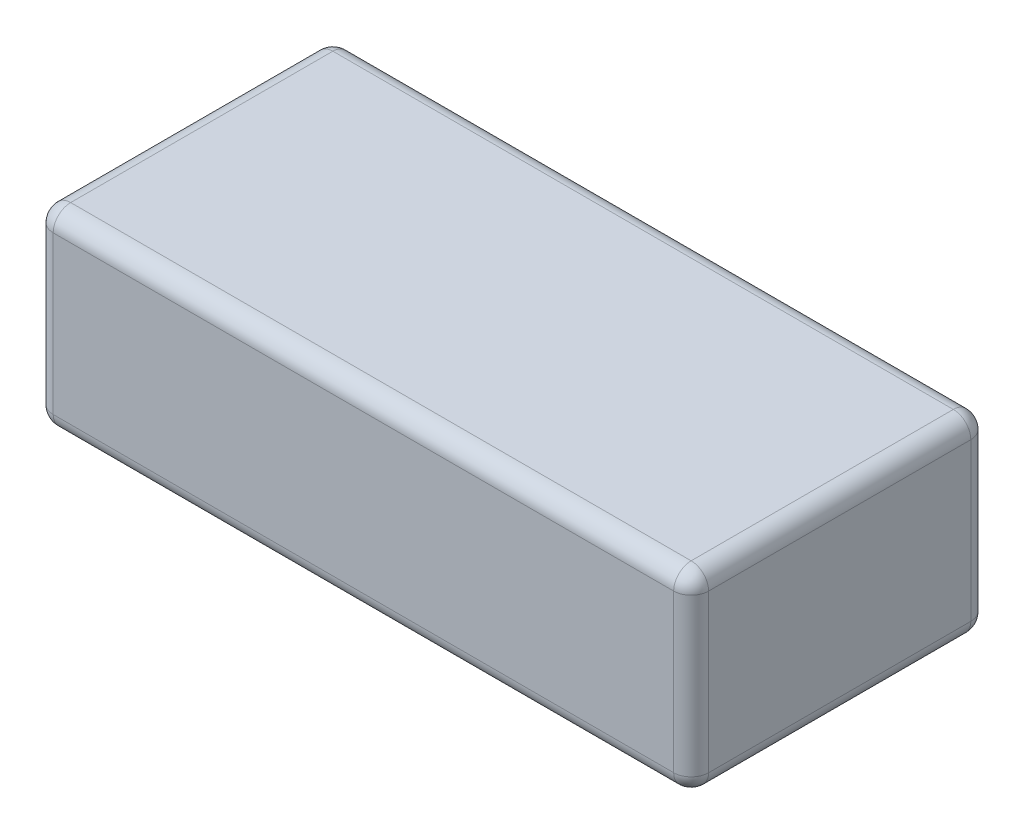
ISO-10303-21;
HEADER;
FILE_DESCRIPTION(('STEP AP214'),'2;1');
FILE_NAME('part.step','',(''),(''),'','','');
FILE_SCHEMA(('AUTOMOTIVE_DESIGN { 1 0 10303 214 1 1 1 1 }'));
ENDSEC;
DATA;
#1=APPLICATION_CONTEXT('core data for automotive mechanical design processes');
#2=APPLICATION_PROTOCOL_DEFINITION('international standard','automotive_design',2000,#1);
#3=PRODUCT_CONTEXT('',#1,'mechanical');
#4=PRODUCT('Part','Part','',(#3));
#5=PRODUCT_RELATED_PRODUCT_CATEGORY('part','',(#4));
#6=PRODUCT_DEFINITION_FORMATION('','',#4);
#7=PRODUCT_DEFINITION_CONTEXT('part definition',#1,'design');
#8=PRODUCT_DEFINITION('design','',#6,#7);
#9=PRODUCT_DEFINITION_SHAPE('','',#8);
#10=(LENGTH_UNIT() NAMED_UNIT(*) SI_UNIT(.MILLI.,.METRE.));
#11=(NAMED_UNIT(*) PLANE_ANGLE_UNIT() SI_UNIT($,.RADIAN.));
#12=(NAMED_UNIT(*) SI_UNIT($,.STERADIAN.) SOLID_ANGLE_UNIT());
#13=UNCERTAINTY_MEASURE_WITH_UNIT(LENGTH_MEASURE(1.E-05),#10,'distance_accuracy_value','');
#14=(GEOMETRIC_REPRESENTATION_CONTEXT(3) GLOBAL_UNCERTAINTY_ASSIGNED_CONTEXT((#13)) GLOBAL_UNIT_ASSIGNED_CONTEXT((#10,
#11,#12)) REPRESENTATION_CONTEXT('',''));
#15=CARTESIAN_POINT('',(0.,0.,0.));
#16=DIRECTION('',(0.,0.,1.));
#17=DIRECTION('',(1.,0.,0.));
#18=AXIS2_PLACEMENT_3D('',#15,#16,#17);
#19=CARTESIAN_POINT('',(35.5,93.,-48.));
#20=DIRECTION('',(0.,-1.,0.));
#21=DIRECTION('',(1.,0.,0.));
#22=AXIS2_PLACEMENT_3D('',#19,#20,#21);
#23=SPHERICAL_SURFACE('',#22,2.);
#24=CARTESIAN_POINT('',(35.5,93.,-48.));
#25=DIRECTION('',(0.,0.,-1.));
#26=DIRECTION('',(1.,0.,0.));
#27=AXIS2_PLACEMENT_3D('',#24,#25,#26);
#28=CIRCLE('',#27,2.);
#29=CARTESIAN_POINT('',(35.5,95.,-48.));
#30=VERTEX_POINT('',#29);
#31=CARTESIAN_POINT('',(37.5,93.,-48.));
#32=VERTEX_POINT('',#31);
#33=EDGE_CURVE('E10',#30,#32,#28,.T.);
#34=ORIENTED_EDGE('',*,*,#33,.F.);
#35=CARTESIAN_POINT('',(35.5,93.,-48.));
#36=DIRECTION('',(1.,0.,0.));
#37=DIRECTION('',(0.,0.,1.));
#38=AXIS2_PLACEMENT_3D('',#35,#36,#37);
#39=CIRCLE('',#38,2.);
#40=CARTESIAN_POINT('',(35.5,93.,-46.));
#41=VERTEX_POINT('',#40);
#42=EDGE_CURVE('E284',#30,#41,#39,.T.);
#43=ORIENTED_EDGE('',*,*,#42,.T.);
#44=CARTESIAN_POINT('',(35.5,93.,-48.));
#45=DIRECTION('',(0.,-1.,0.));
#46=DIRECTION('',(1.,0.,0.));
#47=AXIS2_PLACEMENT_3D('',#44,#45,#46);
#48=CIRCLE('',#47,2.);
#49=EDGE_CURVE('E255',#32,#41,#48,.T.);
#50=ORIENTED_EDGE('',*,*,#49,.F.);
#51=EDGE_LOOP('',(#34,#43,#50));
#52=FACE_BOUND('',#51,.T.);
#53=ADVANCED_FACE('F16',(#52),#23,.T.);
#54=CARTESIAN_POINT('',(35.5,93.,-78.));
#55=DIRECTION('',(0.,0.,1.));
#56=DIRECTION('',(1.,0.,0.));
#57=AXIS2_PLACEMENT_3D('',#54,#55,#56);
#58=SPHERICAL_SURFACE('',#57,2.);
#59=CARTESIAN_POINT('',(35.5,93.,-78.));
#60=DIRECTION('',(0.,-1.,0.));
#61=DIRECTION('',(1.,0.,0.));
#62=AXIS2_PLACEMENT_3D('',#59,#60,#61);
#63=CIRCLE('',#62,2.);
#64=CARTESIAN_POINT('',(35.5,93.,-80.));
#65=VERTEX_POINT('',#64);
#66=CARTESIAN_POINT('',(37.5,93.,-78.));
#67=VERTEX_POINT('',#66);
#68=EDGE_CURVE('E276',#65,#67,#63,.T.);
#69=ORIENTED_EDGE('',*,*,#68,.F.);
#70=CARTESIAN_POINT('',(35.5,93.,-78.));
#71=DIRECTION('',(1.,0.,0.));
#72=DIRECTION('',(0.,1.,0.));
#73=AXIS2_PLACEMENT_3D('',#70,#71,#72);
#74=CIRCLE('',#73,2.);
#75=CARTESIAN_POINT('',(35.5,95.,-78.));
#76=VERTEX_POINT('',#75);
#77=EDGE_CURVE('E219',#65,#76,#74,.T.);
#78=ORIENTED_EDGE('',*,*,#77,.T.);
#79=CARTESIAN_POINT('',(35.5,93.,-78.));
#80=DIRECTION('',(0.,0.,1.));
#81=DIRECTION('',(1.,0.,0.));
#82=AXIS2_PLACEMENT_3D('',#79,#80,#81);
#83=CIRCLE('',#82,2.);
#84=EDGE_CURVE('E24',#67,#76,#83,.T.);
#85=ORIENTED_EDGE('',*,*,#84,.F.);
#86=EDGE_LOOP('',(#69,#78,#85));
#87=FACE_BOUND('',#86,.T.);
#88=ADVANCED_FACE('F297',(#87),#58,.T.);
#89=CARTESIAN_POINT('',(37.5,73.,-80.));
#90=DIRECTION('',(1.,0.,0.));
#91=DIRECTION('',(0.,1.,0.));
#92=AXIS2_PLACEMENT_3D('',#89,#90,#91);
#93=PLANE('',#92);
#94=DIRECTION('',(0.,0.,1.));
#95=VECTOR('',#94,1.);
#96=CARTESIAN_POINT('',(37.5,75.,-80.));
#97=LINE('',#96,#95);
#98=CARTESIAN_POINT('',(37.5,75.,-78.));
#99=VERTEX_POINT('',#98);
#100=CARTESIAN_POINT('',(37.5,75.,-48.));
#101=VERTEX_POINT('',#100);
#102=EDGE_CURVE('E144',#99,#101,#97,.T.);
#103=ORIENTED_EDGE('',*,*,#102,.F.);
#104=DIRECTION('',(0.,1.,0.));
#105=VECTOR('',#104,1.);
#106=CARTESIAN_POINT('',(37.5,73.,-78.));
#107=LINE('',#106,#105);
#108=EDGE_CURVE('E280',#99,#67,#107,.T.);
#109=ORIENTED_EDGE('',*,*,#108,.T.);
#110=DIRECTION('',(0.,0.,1.));
#111=VECTOR('',#110,1.);
#112=CARTESIAN_POINT('',(37.5,93.,-80.));
#113=LINE('',#112,#111);
#114=EDGE_CURVE('E290',#67,#32,#113,.T.);
#115=ORIENTED_EDGE('',*,*,#114,.T.);
#116=DIRECTION('',(0.,1.,0.));
#117=VECTOR('',#116,1.);
#118=CARTESIAN_POINT('',(37.5,73.,-48.));
#119=LINE('',#118,#117);
#120=EDGE_CURVE('E259',#101,#32,#119,.T.);
#121=ORIENTED_EDGE('',*,*,#120,.F.);
#122=EDGE_LOOP('',(#103,#109,#115,#121));
#123=FACE_BOUND('',#122,.T.);
#124=ADVANCED_FACE('F370',(#123),#93,.T.);
#125=CARTESIAN_POINT('',(35.5,75.,-48.));
#126=DIRECTION('',(0.,0.,-1.));
#127=DIRECTION('',(1.,0.,0.));
#128=AXIS2_PLACEMENT_3D('',#125,#126,#127);
#129=SPHERICAL_SURFACE('',#128,2.);
#130=CARTESIAN_POINT('',(35.5,75.,-48.));
#131=DIRECTION('',(0.,1.,0.));
#132=DIRECTION('',(1.,0.,0.));
#133=AXIS2_PLACEMENT_3D('',#130,#131,#132);
#134=CIRCLE('',#133,2.);
#135=CARTESIAN_POINT('',(35.5,75.,-46.));
#136=VERTEX_POINT('',#135);
#137=EDGE_CURVE('E258',#136,#101,#134,.T.);
#138=ORIENTED_EDGE('',*,*,#137,.F.);
#139=CARTESIAN_POINT('',(35.5,75.,-48.));
#140=DIRECTION('',(1.,0.,0.));
#141=DIRECTION('',(0.,-1.,0.));
#142=AXIS2_PLACEMENT_3D('',#139,#140,#141);
#143=CIRCLE('',#142,2.);
#144=CARTESIAN_POINT('',(35.5,73.,-48.));
#145=VERTEX_POINT('',#144);
#146=EDGE_CURVE('E156',#136,#145,#143,.T.);
#147=ORIENTED_EDGE('',*,*,#146,.T.);
#148=CARTESIAN_POINT('',(35.5,75.,-48.));
#149=DIRECTION('',(0.,0.,-1.));
#150=DIRECTION('',(1.,0.,0.));
#151=AXIS2_PLACEMENT_3D('',#148,#149,#150);
#152=CIRCLE('',#151,2.);
#153=EDGE_CURVE('E145',#101,#145,#152,.T.);
#154=ORIENTED_EDGE('',*,*,#153,.F.);
#155=EDGE_LOOP('',(#138,#147,#154));
#156=FACE_BOUND('',#155,.T.);
#157=ADVANCED_FACE('F372',(#156),#129,.T.);
#158=CARTESIAN_POINT('',(35.5,75.,-78.));
#159=DIRECTION('',(0.,0.,1.));
#160=DIRECTION('',(1.,0.,0.));
#161=AXIS2_PLACEMENT_3D('',#158,#159,#160);
#162=SPHERICAL_SURFACE('',#161,2.);
#163=CARTESIAN_POINT('',(35.5,75.,-78.));
#164=DIRECTION('',(0.,0.,-1.));
#165=DIRECTION('',(1.,0.,0.));
#166=AXIS2_PLACEMENT_3D('',#163,#164,#165);
#167=CIRCLE('',#166,2.);
#168=CARTESIAN_POINT('',(35.5,73.,-78.));
#169=VERTEX_POINT('',#168);
#170=EDGE_CURVE('E133',#99,#169,#167,.T.);
#171=ORIENTED_EDGE('',*,*,#170,.T.);
#172=CARTESIAN_POINT('',(35.5,75.,-78.));
#173=DIRECTION('',(-1.,0.,0.));
#174=DIRECTION('',(0.,-1.,0.));
#175=AXIS2_PLACEMENT_3D('',#172,#173,#174);
#176=CIRCLE('',#175,2.);
#177=CARTESIAN_POINT('',(35.5,75.,-80.));
#178=VERTEX_POINT('',#177);
#179=EDGE_CURVE('E136',#178,#169,#176,.T.);
#180=ORIENTED_EDGE('',*,*,#179,.F.);
#181=CARTESIAN_POINT('',(35.5,75.,-78.));
#182=DIRECTION('',(0.,-1.,0.));
#183=DIRECTION('',(1.,0.,0.));
#184=AXIS2_PLACEMENT_3D('',#181,#182,#183);
#185=CIRCLE('',#184,2.);
#186=EDGE_CURVE('E138',#178,#99,#185,.T.);
#187=ORIENTED_EDGE('',*,*,#186,.T.);
#188=EDGE_LOOP('',(#171,#180,#187));
#189=FACE_BOUND('',#188,.T.);
#190=ADVANCED_FACE('F135',(#189),#162,.T.);
#191=CARTESIAN_POINT('',(35.5,93.,-80.));
#192=DIRECTION('',(0.,0.,1.));
#193=DIRECTION('',(1.,0.,0.));
#194=AXIS2_PLACEMENT_3D('',#191,#192,#193);
#195=CYLINDRICAL_SURFACE('',#194,2.);
#196=ORIENTED_EDGE('',*,*,#114,.F.);
#197=ORIENTED_EDGE('',*,*,#84,.T.);
#198=DIRECTION('',(0.,0.,1.));
#199=VECTOR('',#198,1.);
#200=CARTESIAN_POINT('',(35.5,95.,-80.));
#201=LINE('',#200,#199);
#202=EDGE_CURVE('E235',#76,#30,#201,.T.);
#203=ORIENTED_EDGE('',*,*,#202,.T.);
#204=ORIENTED_EDGE('',*,*,#33,.T.);
#205=EDGE_LOOP('',(#196,#197,#203,#204));
#206=FACE_BOUND('',#205,.T.);
#207=ADVANCED_FACE('F294',(#206),#195,.T.);
#208=CARTESIAN_POINT('',(35.5,73.,-48.));
#209=DIRECTION('',(0.,1.,0.));
#210=DIRECTION('',(1.,0.,0.));
#211=AXIS2_PLACEMENT_3D('',#208,#209,#210);
#212=CYLINDRICAL_SURFACE('',#211,2.);
#213=ORIENTED_EDGE('',*,*,#120,.T.);
#214=ORIENTED_EDGE('',*,*,#49,.T.);
#215=DIRECTION('',(0.,1.,0.));
#216=VECTOR('',#215,1.);
#217=CARTESIAN_POINT('',(35.5,73.,-46.));
#218=LINE('',#217,#216);
#219=EDGE_CURVE('E246',#136,#41,#218,.T.);
#220=ORIENTED_EDGE('',*,*,#219,.F.);
#221=ORIENTED_EDGE('',*,*,#137,.T.);
#222=EDGE_LOOP('',(#213,#214,#220,#221));
#223=FACE_BOUND('',#222,.T.);
#224=ADVANCED_FACE('F326',(#223),#212,.T.);
#225=CARTESIAN_POINT('',(-37.5,93.,-48.));
#226=DIRECTION('',(1.,0.,0.));
#227=DIRECTION('',(0.,1.,0.));
#228=AXIS2_PLACEMENT_3D('',#225,#226,#227);
#229=CYLINDRICAL_SURFACE('',#228,2.);
#230=CARTESIAN_POINT('',(-35.5,93.,-48.));
#231=DIRECTION('',(1.,0.,0.));
#232=DIRECTION('',(0.,0.,1.));
#233=AXIS2_PLACEMENT_3D('',#230,#231,#232);
#234=CIRCLE('',#233,2.);
#235=CARTESIAN_POINT('',(-35.5,95.,-48.));
#236=VERTEX_POINT('',#235);
#237=CARTESIAN_POINT('',(-35.5,93.,-46.));
#238=VERTEX_POINT('',#237);
#239=EDGE_CURVE('E254',#236,#238,#234,.T.);
#240=ORIENTED_EDGE('',*,*,#239,.T.);
#241=DIRECTION('',(1.,0.,0.));
#242=VECTOR('',#241,1.);
#243=CARTESIAN_POINT('',(-37.5,93.,-46.));
#244=LINE('',#243,#242);
#245=EDGE_CURVE('E250',#238,#41,#244,.T.);
#246=ORIENTED_EDGE('',*,*,#245,.T.);
#247=ORIENTED_EDGE('',*,*,#42,.F.);
#248=DIRECTION('',(1.,0.,0.));
#249=VECTOR('',#248,1.);
#250=CARTESIAN_POINT('',(-37.5,95.,-48.));
#251=LINE('',#250,#249);
#252=EDGE_CURVE('E262',#236,#30,#251,.T.);
#253=ORIENTED_EDGE('',*,*,#252,.F.);
#254=EDGE_LOOP('',(#240,#246,#247,#253));
#255=FACE_BOUND('',#254,.T.);
#256=ADVANCED_FACE('F309',(#255),#229,.T.);
#257=CARTESIAN_POINT('',(35.5,73.,-78.));
#258=DIRECTION('',(0.,1.,0.));
#259=DIRECTION('',(1.,0.,0.));
#260=AXIS2_PLACEMENT_3D('',#257,#258,#259);
#261=CYLINDRICAL_SURFACE('',#260,2.);
#262=ORIENTED_EDGE('',*,*,#186,.F.);
#263=DIRECTION('',(0.,1.,0.));
#264=VECTOR('',#263,1.);
#265=CARTESIAN_POINT('',(35.5,73.,-80.));
#266=LINE('',#265,#264);
#267=EDGE_CURVE('E228',#178,#65,#266,.T.);
#268=ORIENTED_EDGE('',*,*,#267,.T.);
#269=ORIENTED_EDGE('',*,*,#68,.T.);
#270=ORIENTED_EDGE('',*,*,#108,.F.);
#271=EDGE_LOOP('',(#262,#268,#269,#270));
#272=FACE_BOUND('',#271,.T.);
#273=ADVANCED_FACE('F368',(#272),#261,.T.);
#274=CARTESIAN_POINT('',(-37.5,93.,-78.));
#275=DIRECTION('',(1.,0.,0.));
#276=DIRECTION('',(0.,1.,0.));
#277=AXIS2_PLACEMENT_3D('',#274,#275,#276);
#278=CYLINDRICAL_SURFACE('',#277,2.);
#279=DIRECTION('',(1.,0.,0.));
#280=VECTOR('',#279,1.);
#281=CARTESIAN_POINT('',(-37.5,95.,-78.));
#282=LINE('',#281,#280);
#283=CARTESIAN_POINT('',(-35.5,95.,-78.));
#284=VERTEX_POINT('',#283);
#285=EDGE_CURVE('E157',#284,#76,#282,.T.);
#286=ORIENTED_EDGE('',*,*,#285,.T.);
#287=ORIENTED_EDGE('',*,*,#77,.F.);
#288=DIRECTION('',(1.,0.,0.));
#289=VECTOR('',#288,1.);
#290=CARTESIAN_POINT('',(-37.5,93.,-80.));
#291=LINE('',#290,#289);
#292=CARTESIAN_POINT('',(-35.5,93.,-80.));
#293=VERTEX_POINT('',#292);
#294=EDGE_CURVE('E224',#293,#65,#291,.T.);
#295=ORIENTED_EDGE('',*,*,#294,.F.);
#296=CARTESIAN_POINT('',(-35.5,93.,-78.));
#297=DIRECTION('',(1.,0.,0.));
#298=DIRECTION('',(0.,1.,0.));
#299=AXIS2_PLACEMENT_3D('',#296,#297,#298);
#300=CIRCLE('',#299,2.);
#301=EDGE_CURVE('E238',#293,#284,#300,.T.);
#302=ORIENTED_EDGE('',*,*,#301,.T.);
#303=EDGE_LOOP('',(#286,#287,#295,#302));
#304=FACE_BOUND('',#303,.T.);
#305=ADVANCED_FACE('F300',(#304),#278,.T.);
#306=CARTESIAN_POINT('',(35.5,75.,-80.));
#307=DIRECTION('',(0.,0.,1.));
#308=DIRECTION('',(1.,0.,0.));
#309=AXIS2_PLACEMENT_3D('',#306,#307,#308);
#310=CYLINDRICAL_SURFACE('',#309,2.);
#311=ORIENTED_EDGE('',*,*,#153,.T.);
#312=DIRECTION('',(0.,0.,1.));
#313=VECTOR('',#312,1.);
#314=CARTESIAN_POINT('',(35.5,73.,-80.));
#315=LINE('',#314,#313);
#316=EDGE_CURVE('E160',#169,#145,#315,.T.);
#317=ORIENTED_EDGE('',*,*,#316,.F.);
#318=ORIENTED_EDGE('',*,*,#170,.F.);
#319=ORIENTED_EDGE('',*,*,#102,.T.);
#320=EDGE_LOOP('',(#311,#317,#318,#319));
#321=FACE_BOUND('',#320,.T.);
#322=ADVANCED_FACE('F161',(#321),#310,.T.);
#323=CARTESIAN_POINT('',(-37.5,75.,-48.));
#324=DIRECTION('',(1.,0.,0.));
#325=DIRECTION('',(0.,-1.,0.));
#326=AXIS2_PLACEMENT_3D('',#323,#324,#325);
#327=CYLINDRICAL_SURFACE('',#326,2.);
#328=DIRECTION('',(1.,0.,0.));
#329=VECTOR('',#328,1.);
#330=CARTESIAN_POINT('',(-37.5,73.,-48.));
#331=LINE('',#330,#329);
#332=CARTESIAN_POINT('',(-35.5,73.,-48.));
#333=VERTEX_POINT('',#332);
#334=EDGE_CURVE('E166',#333,#145,#331,.T.);
#335=ORIENTED_EDGE('',*,*,#334,.T.);
#336=ORIENTED_EDGE('',*,*,#146,.F.);
#337=DIRECTION('',(1.,0.,0.));
#338=VECTOR('',#337,1.);
#339=CARTESIAN_POINT('',(-37.5,75.,-46.));
#340=LINE('',#339,#338);
#341=CARTESIAN_POINT('',(-35.5,75.,-46.));
#342=VERTEX_POINT('',#341);
#343=EDGE_CURVE('E242',#342,#136,#340,.T.);
#344=ORIENTED_EDGE('',*,*,#343,.F.);
#345=CARTESIAN_POINT('',(-35.5,75.,-48.));
#346=DIRECTION('',(1.,0.,0.));
#347=DIRECTION('',(0.,-1.,0.));
#348=AXIS2_PLACEMENT_3D('',#345,#346,#347);
#349=CIRCLE('',#348,2.);
#350=EDGE_CURVE('E174',#342,#333,#349,.T.);
#351=ORIENTED_EDGE('',*,*,#350,.T.);
#352=EDGE_LOOP('',(#335,#336,#344,#351));
#353=FACE_BOUND('',#352,.T.);
#354=ADVANCED_FACE('F375',(#353),#327,.T.);
#355=CARTESIAN_POINT('',(-37.5,75.,-78.));
#356=DIRECTION('',(1.,0.,0.));
#357=DIRECTION('',(0.,-1.,0.));
#358=AXIS2_PLACEMENT_3D('',#355,#356,#357);
#359=CYLINDRICAL_SURFACE('',#358,2.);
#360=CARTESIAN_POINT('',(-35.5,75.,-78.));
#361=DIRECTION('',(-1.,0.,0.));
#362=DIRECTION('',(0.,-1.,0.));
#363=AXIS2_PLACEMENT_3D('',#360,#361,#362);
#364=CIRCLE('',#363,2.);
#365=CARTESIAN_POINT('',(-35.5,75.,-80.));
#366=VERTEX_POINT('',#365);
#367=CARTESIAN_POINT('',(-35.5,73.,-78.));
#368=VERTEX_POINT('',#367);
#369=EDGE_CURVE('E181',#366,#368,#364,.T.);
#370=ORIENTED_EDGE('',*,*,#369,.F.);
#371=DIRECTION('',(1.,0.,0.));
#372=VECTOR('',#371,1.);
#373=CARTESIAN_POINT('',(-37.5,75.,-80.));
#374=LINE('',#373,#372);
#375=EDGE_CURVE('E153',#366,#178,#374,.T.);
#376=ORIENTED_EDGE('',*,*,#375,.T.);
#377=ORIENTED_EDGE('',*,*,#179,.T.);
#378=DIRECTION('',(1.,0.,0.));
#379=VECTOR('',#378,1.);
#380=CARTESIAN_POINT('',(-37.5,73.,-78.));
#381=LINE('',#380,#379);
#382=EDGE_CURVE('E151',#368,#169,#381,.T.);
#383=ORIENTED_EDGE('',*,*,#382,.F.);
#384=EDGE_LOOP('',(#370,#376,#377,#383));
#385=FACE_BOUND('',#384,.T.);
#386=ADVANCED_FACE('F149',(#385),#359,.T.);
#387=CARTESIAN_POINT('',(-37.5,95.,-80.));
#388=DIRECTION('',(0.,1.,0.));
#389=DIRECTION('',(1.,0.,0.));
#390=AXIS2_PLACEMENT_3D('',#387,#388,#389);
#391=PLANE('',#390);
#392=DIRECTION('',(0.,0.,1.));
#393=VECTOR('',#392,1.);
#394=CARTESIAN_POINT('',(-35.5,95.,-80.));
#395=LINE('',#394,#393);
#396=EDGE_CURVE('E194',#284,#236,#395,.T.);
#397=ORIENTED_EDGE('',*,*,#396,.T.);
#398=ORIENTED_EDGE('',*,*,#252,.T.);
#399=ORIENTED_EDGE('',*,*,#202,.F.);
#400=ORIENTED_EDGE('',*,*,#285,.F.);
#401=EDGE_LOOP('',(#397,#398,#399,#400));
#402=FACE_BOUND('',#401,.T.);
#403=ADVANCED_FACE('F303',(#402),#391,.T.);
#404=CARTESIAN_POINT('',(-35.5,93.,-48.));
#405=DIRECTION('',(0.,-1.,0.));
#406=DIRECTION('',(-1.,0.,0.));
#407=AXIS2_PLACEMENT_3D('',#404,#405,#406);
#408=SPHERICAL_SURFACE('',#407,2.);
#409=CARTESIAN_POINT('',(-35.5,93.,-48.));
#410=DIRECTION('',(0.,1.,0.));
#411=DIRECTION('',(-1.,0.,0.));
#412=AXIS2_PLACEMENT_3D('',#409,#410,#411);
#413=CIRCLE('',#412,2.);
#414=CARTESIAN_POINT('',(-37.5,93.,-48.));
#415=VERTEX_POINT('',#414);
#416=EDGE_CURVE('E185',#415,#238,#413,.T.);
#417=ORIENTED_EDGE('',*,*,#416,.T.);
#418=ORIENTED_EDGE('',*,*,#239,.F.);
#419=CARTESIAN_POINT('',(-35.5,93.,-48.));
#420=DIRECTION('',(0.,0.,1.));
#421=DIRECTION('',(-1.,0.,0.));
#422=AXIS2_PLACEMENT_3D('',#419,#420,#421);
#423=CIRCLE('',#422,2.);
#424=EDGE_CURVE('E191',#236,#415,#423,.T.);
#425=ORIENTED_EDGE('',*,*,#424,.T.);
#426=EDGE_LOOP('',(#417,#418,#425));
#427=FACE_BOUND('',#426,.T.);
#428=ADVANCED_FACE('F314',(#427),#408,.T.);
#429=CARTESIAN_POINT('',(-37.5,73.,-46.));
#430=DIRECTION('',(0.,0.,1.));
#431=DIRECTION('',(1.,0.,0.));
#432=AXIS2_PLACEMENT_3D('',#429,#430,#431);
#433=PLANE('',#432);
#434=DIRECTION('',(0.,1.,0.));
#435=VECTOR('',#434,1.);
#436=CARTESIAN_POINT('',(-35.5,73.,-46.));
#437=LINE('',#436,#435);
#438=EDGE_CURVE('E208',#342,#238,#437,.T.);
#439=ORIENTED_EDGE('',*,*,#438,.F.);
#440=ORIENTED_EDGE('',*,*,#343,.T.);
#441=ORIENTED_EDGE('',*,*,#219,.T.);
#442=ORIENTED_EDGE('',*,*,#245,.F.);
#443=EDGE_LOOP('',(#439,#440,#441,#442));
#444=FACE_BOUND('',#443,.T.);
#445=ADVANCED_FACE('F323',(#444),#433,.T.);
#446=CARTESIAN_POINT('',(-35.5,93.,-78.));
#447=DIRECTION('',(0.,0.,1.));
#448=DIRECTION('',(-1.,0.,0.));
#449=AXIS2_PLACEMENT_3D('',#446,#447,#448);
#450=SPHERICAL_SURFACE('',#449,2.);
#451=CARTESIAN_POINT('',(-35.5,93.,-78.));
#452=DIRECTION('',(0.,0.,-1.));
#453=DIRECTION('',(-1.,0.,0.));
#454=AXIS2_PLACEMENT_3D('',#451,#452,#453);
#455=CIRCLE('',#454,2.);
#456=CARTESIAN_POINT('',(-37.5,93.,-78.));
#457=VERTEX_POINT('',#456);
#458=EDGE_CURVE('E215',#457,#284,#455,.T.);
#459=ORIENTED_EDGE('',*,*,#458,.T.);
#460=ORIENTED_EDGE('',*,*,#301,.F.);
#461=CARTESIAN_POINT('',(-35.5,93.,-78.));
#462=DIRECTION('',(0.,1.,0.));
#463=DIRECTION('',(-1.,0.,0.));
#464=AXIS2_PLACEMENT_3D('',#461,#462,#463);
#465=CIRCLE('',#464,2.);
#466=EDGE_CURVE('E190',#293,#457,#465,.T.);
#467=ORIENTED_EDGE('',*,*,#466,.T.);
#468=EDGE_LOOP('',(#459,#460,#467));
#469=FACE_BOUND('',#468,.T.);
#470=ADVANCED_FACE('F416',(#469),#450,.T.);
#471=CARTESIAN_POINT('',(-37.5,73.,-80.));
#472=DIRECTION('',(0.,0.,1.));
#473=DIRECTION('',(1.,0.,0.));
#474=AXIS2_PLACEMENT_3D('',#471,#472,#473);
#475=PLANE('',#474);
#476=ORIENTED_EDGE('',*,*,#294,.T.);
#477=ORIENTED_EDGE('',*,*,#267,.F.);
#478=ORIENTED_EDGE('',*,*,#375,.F.);
#479=DIRECTION('',(0.,1.,0.));
#480=VECTOR('',#479,1.);
#481=CARTESIAN_POINT('',(-35.5,73.,-80.));
#482=LINE('',#481,#480);
#483=EDGE_CURVE('E198',#366,#293,#482,.T.);
#484=ORIENTED_EDGE('',*,*,#483,.T.);
#485=EDGE_LOOP('',(#476,#477,#478,#484));
#486=FACE_BOUND('',#485,.T.);
#487=ADVANCED_FACE('F366',(#486),#475,.F.);
#488=CARTESIAN_POINT('',(-37.5,73.,-80.));
#489=DIRECTION('',(0.,1.,0.));
#490=DIRECTION('',(1.,0.,0.));
#491=AXIS2_PLACEMENT_3D('',#488,#489,#490);
#492=PLANE('',#491);
#493=ORIENTED_EDGE('',*,*,#382,.T.);
#494=ORIENTED_EDGE('',*,*,#316,.T.);
#495=ORIENTED_EDGE('',*,*,#334,.F.);
#496=DIRECTION('',(0.,0.,1.));
#497=VECTOR('',#496,1.);
#498=CARTESIAN_POINT('',(-35.5,73.,-80.));
#499=LINE('',#498,#497);
#500=EDGE_CURVE('E171',#368,#333,#499,.T.);
#501=ORIENTED_EDGE('',*,*,#500,.F.);
#502=EDGE_LOOP('',(#493,#494,#495,#501));
#503=FACE_BOUND('',#502,.T.);
#504=ADVANCED_FACE('F169',(#503),#492,.F.);
#505=CARTESIAN_POINT('',(-35.5,75.,-48.));
#506=DIRECTION('',(0.,0.,-1.));
#507=DIRECTION('',(-1.,0.,0.));
#508=AXIS2_PLACEMENT_3D('',#505,#506,#507);
#509=SPHERICAL_SURFACE('',#508,2.);
#510=CARTESIAN_POINT('',(-35.5,75.,-48.));
#511=DIRECTION('',(0.,0.,1.));
#512=DIRECTION('',(-1.,0.,0.));
#513=AXIS2_PLACEMENT_3D('',#510,#511,#512);
#514=CIRCLE('',#513,2.);
#515=CARTESIAN_POINT('',(-37.5,75.,-48.));
#516=VERTEX_POINT('',#515);
#517=EDGE_CURVE('E187',#516,#333,#514,.T.);
#518=ORIENTED_EDGE('',*,*,#517,.T.);
#519=ORIENTED_EDGE('',*,*,#350,.F.);
#520=CARTESIAN_POINT('',(-35.5,75.,-48.));
#521=DIRECTION('',(0.,-1.,0.));
#522=DIRECTION('',(-1.,0.,0.));
#523=AXIS2_PLACEMENT_3D('',#520,#521,#522);
#524=CIRCLE('',#523,2.);
#525=EDGE_CURVE('E205',#342,#516,#524,.T.);
#526=ORIENTED_EDGE('',*,*,#525,.T.);
#527=EDGE_LOOP('',(#518,#519,#526));
#528=FACE_BOUND('',#527,.T.);
#529=ADVANCED_FACE('F378',(#528),#509,.T.);
#530=CARTESIAN_POINT('',(-35.5,75.,-78.));
#531=DIRECTION('',(0.,0.,1.));
#532=DIRECTION('',(-1.,0.,0.));
#533=AXIS2_PLACEMENT_3D('',#530,#531,#532);
#534=SPHERICAL_SURFACE('',#533,2.);
#535=CARTESIAN_POINT('',(-35.5,75.,-78.));
#536=DIRECTION('',(0.,1.,0.));
#537=DIRECTION('',(-1.,0.,0.));
#538=AXIS2_PLACEMENT_3D('',#535,#536,#537);
#539=CIRCLE('',#538,2.);
#540=CARTESIAN_POINT('',(-37.5,75.,-78.));
#541=VERTEX_POINT('',#540);
#542=EDGE_CURVE('E202',#366,#541,#539,.T.);
#543=ORIENTED_EDGE('',*,*,#542,.F.);
#544=ORIENTED_EDGE('',*,*,#369,.T.);
#545=CARTESIAN_POINT('',(-35.5,75.,-78.));
#546=DIRECTION('',(0.,0.,1.));
#547=DIRECTION('',(-1.,0.,0.));
#548=AXIS2_PLACEMENT_3D('',#545,#546,#547);
#549=CIRCLE('',#548,2.);
#550=EDGE_CURVE('E346',#541,#368,#549,.T.);
#551=ORIENTED_EDGE('',*,*,#550,.F.);
#552=EDGE_LOOP('',(#543,#544,#551));
#553=FACE_BOUND('',#552,.T.);
#554=ADVANCED_FACE('F360',(#553),#534,.T.);
#555=CARTESIAN_POINT('',(-35.5,93.,-80.));
#556=DIRECTION('',(0.,0.,1.));
#557=DIRECTION('',(-1.,0.,0.));
#558=AXIS2_PLACEMENT_3D('',#555,#556,#557);
#559=CYLINDRICAL_SURFACE('',#558,2.);
#560=ORIENTED_EDGE('',*,*,#424,.F.);
#561=ORIENTED_EDGE('',*,*,#396,.F.);
#562=ORIENTED_EDGE('',*,*,#458,.F.);
#563=DIRECTION('',(0.,0.,1.));
#564=VECTOR('',#563,1.);
#565=CARTESIAN_POINT('',(-37.5,93.,-80.));
#566=LINE('',#565,#564);
#567=EDGE_CURVE('E337',#457,#415,#566,.T.);
#568=ORIENTED_EDGE('',*,*,#567,.T.);
#569=EDGE_LOOP('',(#560,#561,#562,#568));
#570=FACE_BOUND('',#569,.T.);
#571=ADVANCED_FACE('F386',(#570),#559,.T.);
#572=CARTESIAN_POINT('',(-35.5,73.,-48.));
#573=DIRECTION('',(0.,1.,0.));
#574=DIRECTION('',(-1.,0.,0.));
#575=AXIS2_PLACEMENT_3D('',#572,#573,#574);
#576=CYLINDRICAL_SURFACE('',#575,2.);
#577=ORIENTED_EDGE('',*,*,#525,.F.);
#578=ORIENTED_EDGE('',*,*,#438,.T.);
#579=ORIENTED_EDGE('',*,*,#416,.F.);
#580=DIRECTION('',(0.,1.,0.));
#581=VECTOR('',#580,1.);
#582=CARTESIAN_POINT('',(-37.5,73.,-48.));
#583=LINE('',#582,#581);
#584=EDGE_CURVE('E528',#516,#415,#583,.T.);
#585=ORIENTED_EDGE('',*,*,#584,.F.);
#586=EDGE_LOOP('',(#577,#578,#579,#585));
#587=FACE_BOUND('',#586,.T.);
#588=ADVANCED_FACE('F321',(#587),#576,.T.);
#589=CARTESIAN_POINT('',(-35.5,73.,-78.));
#590=DIRECTION('',(0.,1.,0.));
#591=DIRECTION('',(-1.,0.,0.));
#592=AXIS2_PLACEMENT_3D('',#589,#590,#591);
#593=CYLINDRICAL_SURFACE('',#592,2.);
#594=DIRECTION('',(0.,1.,0.));
#595=VECTOR('',#594,1.);
#596=CARTESIAN_POINT('',(-37.5,73.,-78.));
#597=LINE('',#596,#595);
#598=EDGE_CURVE('E339',#541,#457,#597,.T.);
#599=ORIENTED_EDGE('',*,*,#598,.T.);
#600=ORIENTED_EDGE('',*,*,#466,.F.);
#601=ORIENTED_EDGE('',*,*,#483,.F.);
#602=ORIENTED_EDGE('',*,*,#542,.T.);
#603=EDGE_LOOP('',(#599,#600,#601,#602));
#604=FACE_BOUND('',#603,.T.);
#605=ADVANCED_FACE('F364',(#604),#593,.T.);
#606=CARTESIAN_POINT('',(-35.5,75.,-80.));
#607=DIRECTION('',(0.,0.,1.));
#608=DIRECTION('',(-1.,0.,0.));
#609=AXIS2_PLACEMENT_3D('',#606,#607,#608);
#610=CYLINDRICAL_SURFACE('',#609,2.);
#611=DIRECTION('',(0.,0.,1.));
#612=VECTOR('',#611,1.);
#613=CARTESIAN_POINT('',(-37.5,75.,-80.));
#614=LINE('',#613,#612);
#615=EDGE_CURVE('E342',#541,#516,#614,.T.);
#616=ORIENTED_EDGE('',*,*,#615,.F.);
#617=ORIENTED_EDGE('',*,*,#550,.T.);
#618=ORIENTED_EDGE('',*,*,#500,.T.);
#619=ORIENTED_EDGE('',*,*,#517,.F.);
#620=EDGE_LOOP('',(#616,#617,#618,#619));
#621=FACE_BOUND('',#620,.T.);
#622=ADVANCED_FACE('F355',(#621),#610,.T.);
#623=CARTESIAN_POINT('',(-37.5,73.,-80.));
#624=DIRECTION('',(1.,0.,0.));
#625=DIRECTION('',(0.,1.,0.));
#626=AXIS2_PLACEMENT_3D('',#623,#624,#625);
#627=PLANE('',#626);
#628=ORIENTED_EDGE('',*,*,#584,.T.);
#629=ORIENTED_EDGE('',*,*,#567,.F.);
#630=ORIENTED_EDGE('',*,*,#598,.F.);
#631=ORIENTED_EDGE('',*,*,#615,.T.);
#632=EDGE_LOOP('',(#628,#629,#630,#631));
#633=FACE_BOUND('',#632,.T.);
#634=ADVANCED_FACE('F440',(#633),#627,.F.);
#635=CLOSED_SHELL('',(#53,#88,#124,#157,#190,#207,#224,#256,#273,#305,#322,#354,#386,#403,#428,
#445,#470,#487,#504,#529,#554,#571,#588,#605,#622,#634));
#636=MANIFOLD_SOLID_BREP('B1',#635);
#637=ADVANCED_BREP_SHAPE_REPRESENTATION('',(#18,#636),#14);
#638=SHAPE_DEFINITION_REPRESENTATION(#9,#637);
ENDSEC;
END-ISO-10303-21;
